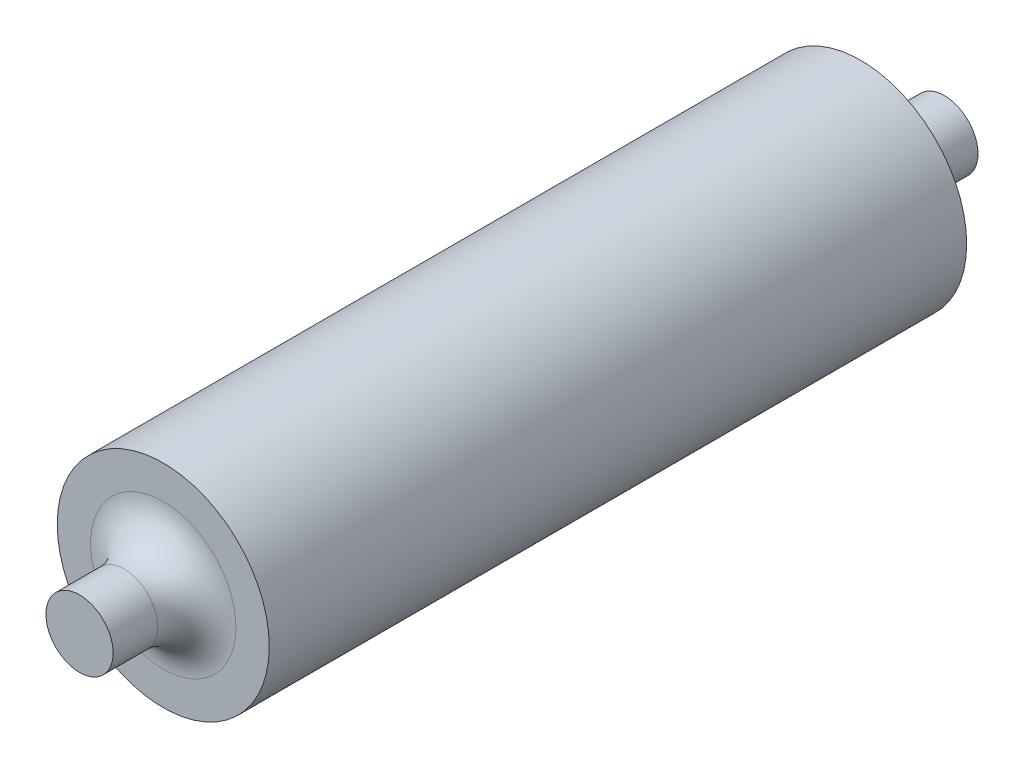
ISO-10303-21;
HEADER;
FILE_DESCRIPTION(('STEP AP214'),'2;1');
FILE_NAME('part.step','',(''),(''),'','','');
FILE_SCHEMA(('AUTOMOTIVE_DESIGN { 1 0 10303 214 1 1 1 1 }'));
ENDSEC;
DATA;
#1=APPLICATION_CONTEXT('core data for automotive mechanical design processes');
#2=APPLICATION_PROTOCOL_DEFINITION('international standard','automotive_design',2000,#1);
#3=PRODUCT_CONTEXT('',#1,'mechanical');
#4=PRODUCT('Part','Part','',(#3));
#5=PRODUCT_RELATED_PRODUCT_CATEGORY('part','',(#4));
#6=PRODUCT_DEFINITION_FORMATION('','',#4);
#7=PRODUCT_DEFINITION_CONTEXT('part definition',#1,'design');
#8=PRODUCT_DEFINITION('design','',#6,#7);
#9=PRODUCT_DEFINITION_SHAPE('','',#8);
#10=(LENGTH_UNIT() NAMED_UNIT(*) SI_UNIT(.MILLI.,.METRE.));
#11=(NAMED_UNIT(*) PLANE_ANGLE_UNIT() SI_UNIT($,.RADIAN.));
#12=(NAMED_UNIT(*) SI_UNIT($,.STERADIAN.) SOLID_ANGLE_UNIT());
#13=UNCERTAINTY_MEASURE_WITH_UNIT(LENGTH_MEASURE(1.E-05),#10,'distance_accuracy_value','');
#14=(GEOMETRIC_REPRESENTATION_CONTEXT(3) GLOBAL_UNCERTAINTY_ASSIGNED_CONTEXT((#13)) GLOBAL_UNIT_ASSIGNED_CONTEXT((#10,
#11,#12)) REPRESENTATION_CONTEXT('',''));
#15=CARTESIAN_POINT('',(0.,0.,0.));
#16=DIRECTION('',(0.,0.,1.));
#17=DIRECTION('',(1.,0.,0.));
#18=AXIS2_PLACEMENT_3D('',#15,#16,#17);
#19=CARTESIAN_POINT('',(0.,0.,-125.));
#20=DIRECTION('',(0.,0.,1.));
#21=DIRECTION('',(1.,0.,0.));
#22=AXIS2_PLACEMENT_3D('',#19,#20,#21);
#23=CYLINDRICAL_SURFACE('',#22,19.);
#24=CARTESIAN_POINT('',(0.,0.,-125.));
#25=DIRECTION('',(0.,0.,1.));
#26=DIRECTION('',(1.,0.,0.));
#27=AXIS2_PLACEMENT_3D('',#24,#25,#26);
#28=CIRCLE('',#27,19.);
#29=CARTESIAN_POINT('',(19.,0.,-125.));
#30=VERTEX_POINT('',#29);
#31=EDGE_CURVE('E108',#30,#30,#28,.T.);
#32=ORIENTED_EDGE('',*,*,#31,.T.);
#33=EDGE_LOOP('',(#32));
#34=FACE_BOUND('',#33,.T.);
#35=CARTESIAN_POINT('',(0.,0.,0.));
#36=DIRECTION('',(0.,0.,1.));
#37=DIRECTION('',(1.,0.,0.));
#38=AXIS2_PLACEMENT_3D('',#35,#36,#37);
#39=CIRCLE('',#38,19.);
#40=CARTESIAN_POINT('',(19.,0.,0.));
#41=VERTEX_POINT('',#40);
#42=EDGE_CURVE('E109',#41,#41,#39,.T.);
#43=ORIENTED_EDGE('',*,*,#42,.F.);
#44=EDGE_LOOP('',(#43));
#45=FACE_BOUND('',#44,.T.);
#46=ADVANCED_FACE('F38',(#34,#45),#23,.T.);
#47=CARTESIAN_POINT('',(0.,0.,-125.));
#48=DIRECTION('',(0.,0.,1.));
#49=DIRECTION('',(1.,0.,0.));
#50=AXIS2_PLACEMENT_3D('',#47,#48,#49);
#51=PLANE('',#50);
#52=CARTESIAN_POINT('',(0.,0.,-125.));
#53=DIRECTION('',(0.,0.,1.));
#54=DIRECTION('',(1.,0.,0.));
#55=AXIS2_PLACEMENT_3D('',#52,#53,#54);
#56=CIRCLE('',#55,13.025);
#57=CARTESIAN_POINT('',(13.025,0.,-125.));
#58=VERTEX_POINT('',#57);
#59=EDGE_CURVE('E47',#58,#58,#56,.T.);
#60=ORIENTED_EDGE('',*,*,#59,.T.);
#61=EDGE_LOOP('',(#60));
#62=FACE_BOUND('',#61,.T.);
#63=ORIENTED_EDGE('',*,*,#31,.F.);
#64=EDGE_LOOP('',(#63));
#65=FACE_BOUND('',#64,.T.);
#66=ADVANCED_FACE('F219',(#62,#65),#51,.F.);
#67=CARTESIAN_POINT('',(0.,0.,0.));
#68=DIRECTION('',(0.,0.,1.));
#69=DIRECTION('',(1.,0.,0.));
#70=AXIS2_PLACEMENT_3D('',#67,#68,#69);
#71=PLANE('',#70);
#72=CARTESIAN_POINT('',(0.,0.,0.));
#73=DIRECTION('',(0.,0.,1.));
#74=DIRECTION('',(1.,0.,0.));
#75=AXIS2_PLACEMENT_3D('',#72,#73,#74);
#76=CIRCLE('',#75,13.025);
#77=CARTESIAN_POINT('',(13.025,0.,0.));
#78=VERTEX_POINT('',#77);
#79=EDGE_CURVE('E52',#78,#78,#76,.F.);
#80=ORIENTED_EDGE('',*,*,#79,.T.);
#81=EDGE_LOOP('',(#80));
#82=FACE_BOUND('',#81,.T.);
#83=ORIENTED_EDGE('',*,*,#42,.T.);
#84=EDGE_LOOP('',(#83));
#85=FACE_BOUND('',#84,.T.);
#86=ADVANCED_FACE('F201',(#82,#85),#71,.T.);
#87=CARTESIAN_POINT('',(0.,0.,15.));
#88=DIRECTION('',(0.,0.,1.));
#89=DIRECTION('',(1.,0.,0.));
#90=AXIS2_PLACEMENT_3D('',#87,#88,#89);
#91=PLANE('',#90);
#92=CARTESIAN_POINT('',(0.,0.,15.));
#93=DIRECTION('',(0.,0.,1.));
#94=DIRECTION('',(1.,0.,0.));
#95=AXIS2_PLACEMENT_3D('',#92,#93,#94);
#96=CIRCLE('',#95,6.025);
#97=CARTESIAN_POINT('',(6.025,0.,15.));
#98=VERTEX_POINT('',#97);
#99=EDGE_CURVE('E89',#98,#98,#96,.T.);
#100=ORIENTED_EDGE('',*,*,#99,.T.);
#101=EDGE_LOOP('',(#100));
#102=FACE_BOUND('',#101,.T.);
#103=ADVANCED_FACE('F197',(#102),#91,.T.);
#104=CARTESIAN_POINT('',(0.,0.,-140.));
#105=DIRECTION('',(0.,0.,1.));
#106=DIRECTION('',(1.,0.,0.));
#107=AXIS2_PLACEMENT_3D('',#104,#105,#106);
#108=CYLINDRICAL_SURFACE('',#107,6.025);
#109=CARTESIAN_POINT('',(0.,0.,7.00000000000001));
#110=DIRECTION('',(0.,0.,1.));
#111=DIRECTION('',(1.,0.,0.));
#112=AXIS2_PLACEMENT_3D('',#109,#110,#111);
#113=CIRCLE('',#112,6.025);
#114=CARTESIAN_POINT('',(6.025,0.,7.00000000000001));
#115=VERTEX_POINT('',#114);
#116=EDGE_CURVE('E57',#115,#115,#113,.T.);
#117=ORIENTED_EDGE('',*,*,#116,.T.);
#118=EDGE_LOOP('',(#117));
#119=FACE_BOUND('',#118,.T.);
#120=ORIENTED_EDGE('',*,*,#99,.F.);
#121=EDGE_LOOP('',(#120));
#122=FACE_BOUND('',#121,.T.);
#123=ADVANCED_FACE('F200',(#119,#122),#108,.T.);
#124=CARTESIAN_POINT('',(0.,0.,-132.));
#125=DIRECTION('',(0.,0.,1.));
#126=DIRECTION('',(1.,0.,0.));
#127=AXIS2_PLACEMENT_3D('',#124,#125,#126);
#128=CIRCLE('',#127,6.025);
#129=CARTESIAN_POINT('',(6.025,0.,-132.));
#130=VERTEX_POINT('',#129);
#131=EDGE_CURVE('E11',#130,#130,#128,.F.);
#132=ORIENTED_EDGE('',*,*,#131,.T.);
#133=EDGE_LOOP('',(#132));
#134=FACE_BOUND('',#133,.T.);
#135=CARTESIAN_POINT('',(0.,0.,-140.));
#136=DIRECTION('',(0.,0.,1.));
#137=DIRECTION('',(1.,0.,0.));
#138=AXIS2_PLACEMENT_3D('',#135,#136,#137);
#139=CIRCLE('',#138,6.025);
#140=CARTESIAN_POINT('',(6.025,0.,-140.));
#141=VERTEX_POINT('',#140);
#142=EDGE_CURVE('E100',#141,#141,#139,.T.);
#143=ORIENTED_EDGE('',*,*,#142,.T.);
#144=EDGE_LOOP('',(#143));
#145=FACE_BOUND('',#144,.T.);
#146=ADVANCED_FACE('F207',(#134,#145),#108,.T.);
#147=CARTESIAN_POINT('',(0.,0.,-140.));
#148=DIRECTION('',(0.,0.,1.));
#149=DIRECTION('',(1.,0.,0.));
#150=AXIS2_PLACEMENT_3D('',#147,#148,#149);
#151=PLANE('',#150);
#152=ORIENTED_EDGE('',*,*,#142,.F.);
#153=EDGE_LOOP('',(#152));
#154=FACE_BOUND('',#153,.T.);
#155=ADVANCED_FACE('F203',(#154),#151,.F.);
#156=CARTESIAN_POINT('',(0.,0.,7.00000000000001));
#157=DIRECTION('',(0.,0.,1.));
#158=DIRECTION('',(1.,0.,0.));
#159=AXIS2_PLACEMENT_3D('',#156,#157,#158);
#160=TOROIDAL_SURFACE('',#159,13.025,7.);
#161=ORIENTED_EDGE('',*,*,#79,.F.);
#162=EDGE_LOOP('',(#161));
#163=FACE_BOUND('',#162,.T.);
#164=ORIENTED_EDGE('',*,*,#116,.F.);
#165=EDGE_LOOP('',(#164));
#166=FACE_BOUND('',#165,.T.);
#167=ADVANCED_FACE('F206',(#163,#166),#160,.F.);
#168=CARTESIAN_POINT('',(0.,0.,-132.));
#169=DIRECTION('',(0.,0.,1.));
#170=DIRECTION('',(1.,0.,0.));
#171=AXIS2_PLACEMENT_3D('',#168,#169,#170);
#172=TOROIDAL_SURFACE('',#171,13.025,7.);
#173=ORIENTED_EDGE('',*,*,#131,.F.);
#174=EDGE_LOOP('',(#173));
#175=FACE_BOUND('',#174,.T.);
#176=ORIENTED_EDGE('',*,*,#59,.F.);
#177=EDGE_LOOP('',(#176));
#178=FACE_BOUND('',#177,.T.);
#179=ADVANCED_FACE('F40',(#175,#178),#172,.F.);
#180=CLOSED_SHELL('',(#46,#66,#86,#103,#123,#146,#155,#167,#179));
#181=CARTESIAN_POINT('',(0.,0.,-27.5));
#182=DIRECTION('',(0.,0.,1.));
#183=DIRECTION('',(1.,0.,0.));
#184=AXIS2_PLACEMENT_3D('',#181,#182,#183);
#185=PLANE('',#184);
#186=CARTESIAN_POINT('',(0.,0.,-27.5));
#187=DIRECTION('',(0.,0.,1.));
#188=DIRECTION('',(1.,0.,0.));
#189=AXIS2_PLACEMENT_3D('',#186,#187,#188);
#190=CIRCLE('',#189,6.025);
#191=CARTESIAN_POINT('',(6.025,0.,-27.5));
#192=VERTEX_POINT('',#191);
#193=EDGE_CURVE('E70',#192,#192,#190,.F.);
#194=ORIENTED_EDGE('',*,*,#193,.T.);
#195=EDGE_LOOP('',(#194));
#196=FACE_BOUND('',#195,.T.);
#197=CARTESIAN_POINT('',(0.,0.,-27.5));
#198=DIRECTION('',(0.,0.,1.));
#199=DIRECTION('',(1.,0.,0.));
#200=AXIS2_PLACEMENT_3D('',#197,#198,#199);
#201=CIRCLE('',#200,14.);
#202=CARTESIAN_POINT('',(14.,0.,-27.5));
#203=VERTEX_POINT('',#202);
#204=EDGE_CURVE('E69',#203,#203,#201,.F.);
#205=ORIENTED_EDGE('',*,*,#204,.F.);
#206=EDGE_LOOP('',(#205));
#207=FACE_BOUND('',#206,.T.);
#208=ADVANCED_FACE('F147',(#196,#207),#185,.T.);
#209=CARTESIAN_POINT('',(0.,0.,-125.));
#210=DIRECTION('',(0.,0.,1.));
#211=DIRECTION('',(1.,0.,0.));
#212=AXIS2_PLACEMENT_3D('',#209,#210,#211);
#213=CYLINDRICAL_SURFACE('',#212,14.);
#214=ORIENTED_EDGE('',*,*,#204,.T.);
#215=EDGE_LOOP('',(#214));
#216=FACE_BOUND('',#215,.T.);
#217=CARTESIAN_POINT('',(0.,0.,-7.50000000000001));
#218=DIRECTION('',(0.,0.,1.));
#219=DIRECTION('',(1.,0.,0.));
#220=AXIS2_PLACEMENT_3D('',#217,#218,#219);
#221=CIRCLE('',#220,14.);
#222=CARTESIAN_POINT('',(14.,0.,-7.50000000000001));
#223=VERTEX_POINT('',#222);
#224=EDGE_CURVE('E104',#223,#223,#221,.F.);
#225=ORIENTED_EDGE('',*,*,#224,.F.);
#226=EDGE_LOOP('',(#225));
#227=FACE_BOUND('',#226,.T.);
#228=ADVANCED_FACE('F144',(#216,#227),#213,.F.);
#229=CARTESIAN_POINT('',(0.,0.,-7.5));
#230=DIRECTION('',(0.,0.,1.));
#231=DIRECTION('',(1.,0.,0.));
#232=AXIS2_PLACEMENT_3D('',#229,#230,#231);
#233=PLANE('',#232);
#234=CARTESIAN_POINT('',(0.,0.,-7.50000000000001));
#235=DIRECTION('',(0.,0.,1.));
#236=DIRECTION('',(1.,0.,0.));
#237=AXIS2_PLACEMENT_3D('',#234,#235,#236);
#238=CIRCLE('',#237,6.025);
#239=CARTESIAN_POINT('',(6.025,0.,-7.50000000000001));
#240=VERTEX_POINT('',#239);
#241=EDGE_CURVE('E99',#240,#240,#238,.T.);
#242=ORIENTED_EDGE('',*,*,#241,.T.);
#243=EDGE_LOOP('',(#242));
#244=FACE_BOUND('',#243,.T.);
#245=ORIENTED_EDGE('',*,*,#224,.T.);
#246=EDGE_LOOP('',(#245));
#247=FACE_BOUND('',#246,.T.);
#248=ADVANCED_FACE('F157',(#244,#247),#233,.F.);
#249=ORIENTED_EDGE('',*,*,#193,.F.);
#250=EDGE_LOOP('',(#249));
#251=FACE_BOUND('',#250,.T.);
#252=ORIENTED_EDGE('',*,*,#241,.F.);
#253=EDGE_LOOP('',(#252));
#254=FACE_BOUND('',#253,.T.);
#255=ADVANCED_FACE('F216',(#251,#254),#108,.T.);
#256=CLOSED_SHELL('',(#208,#228,#248,#255));
#257=CARTESIAN_POINT('',(0.,0.,-87.5));
#258=DIRECTION('',(0.,0.,1.));
#259=DIRECTION('',(1.,0.,0.));
#260=AXIS2_PLACEMENT_3D('',#257,#258,#259);
#261=PLANE('',#260);
#262=CARTESIAN_POINT('',(0.,0.,-87.5));
#263=DIRECTION('',(0.,0.,1.));
#264=DIRECTION('',(1.,0.,0.));
#265=AXIS2_PLACEMENT_3D('',#262,#263,#264);
#266=CIRCLE('',#265,6.025);
#267=CARTESIAN_POINT('',(6.025,0.,-87.5));
#268=VERTEX_POINT('',#267);
#269=EDGE_CURVE('E80',#268,#268,#266,.F.);
#270=ORIENTED_EDGE('',*,*,#269,.T.);
#271=EDGE_LOOP('',(#270));
#272=FACE_BOUND('',#271,.T.);
#273=CARTESIAN_POINT('',(0.,0.,-87.5));
#274=DIRECTION('',(0.,0.,1.));
#275=DIRECTION('',(1.,0.,0.));
#276=AXIS2_PLACEMENT_3D('',#273,#274,#275);
#277=CIRCLE('',#276,14.);
#278=CARTESIAN_POINT('',(14.,0.,-87.5));
#279=VERTEX_POINT('',#278);
#280=EDGE_CURVE('E68',#279,#279,#277,.F.);
#281=ORIENTED_EDGE('',*,*,#280,.F.);
#282=EDGE_LOOP('',(#281));
#283=FACE_BOUND('',#282,.T.);
#284=ADVANCED_FACE('F168',(#272,#283),#261,.T.);
#285=ORIENTED_EDGE('',*,*,#280,.T.);
#286=EDGE_LOOP('',(#285));
#287=FACE_BOUND('',#286,.T.);
#288=CARTESIAN_POINT('',(0.,0.,-67.5));
#289=DIRECTION('',(0.,0.,1.));
#290=DIRECTION('',(1.,0.,0.));
#291=AXIS2_PLACEMENT_3D('',#288,#289,#290);
#292=CIRCLE('',#291,14.);
#293=CARTESIAN_POINT('',(14.,0.,-67.5));
#294=VERTEX_POINT('',#293);
#295=EDGE_CURVE('E84',#294,#294,#292,.F.);
#296=ORIENTED_EDGE('',*,*,#295,.F.);
#297=EDGE_LOOP('',(#296));
#298=FACE_BOUND('',#297,.T.);
#299=ADVANCED_FACE('F160',(#287,#298),#213,.F.);
#300=CARTESIAN_POINT('',(0.,0.,-67.5));
#301=DIRECTION('',(0.,0.,1.));
#302=DIRECTION('',(1.,0.,0.));
#303=AXIS2_PLACEMENT_3D('',#300,#301,#302);
#304=PLANE('',#303);
#305=CARTESIAN_POINT('',(0.,0.,-67.5));
#306=DIRECTION('',(0.,0.,1.));
#307=DIRECTION('',(1.,0.,0.));
#308=AXIS2_PLACEMENT_3D('',#305,#306,#307);
#309=CIRCLE('',#308,6.025);
#310=CARTESIAN_POINT('',(6.025,0.,-67.5));
#311=VERTEX_POINT('',#310);
#312=EDGE_CURVE('E85',#311,#311,#309,.F.);
#313=ORIENTED_EDGE('',*,*,#312,.F.);
#314=EDGE_LOOP('',(#313));
#315=FACE_BOUND('',#314,.T.);
#316=ORIENTED_EDGE('',*,*,#295,.T.);
#317=EDGE_LOOP('',(#316));
#318=FACE_BOUND('',#317,.T.);
#319=ADVANCED_FACE('F175',(#315,#318),#304,.F.);
#320=ORIENTED_EDGE('',*,*,#269,.F.);
#321=EDGE_LOOP('',(#320));
#322=FACE_BOUND('',#321,.T.);
#323=ORIENTED_EDGE('',*,*,#312,.T.);
#324=EDGE_LOOP('',(#323));
#325=FACE_BOUND('',#324,.T.);
#326=ADVANCED_FACE('F195',(#322,#325),#108,.T.);
#327=CLOSED_SHELL('',(#284,#299,#319,#326));
#328=CARTESIAN_POINT('',(0.,0.,-57.5));
#329=DIRECTION('',(0.,0.,1.));
#330=DIRECTION('',(1.,0.,0.));
#331=AXIS2_PLACEMENT_3D('',#328,#329,#330);
#332=CIRCLE('',#331,14.);
#333=CARTESIAN_POINT('',(14.,0.,-57.5));
#334=VERTEX_POINT('',#333);
#335=EDGE_CURVE('E79',#334,#334,#332,.F.);
#336=ORIENTED_EDGE('',*,*,#335,.T.);
#337=EDGE_LOOP('',(#336));
#338=FACE_BOUND('',#337,.T.);
#339=CARTESIAN_POINT('',(0.,0.,-37.5));
#340=DIRECTION('',(0.,0.,1.));
#341=DIRECTION('',(1.,0.,0.));
#342=AXIS2_PLACEMENT_3D('',#339,#340,#341);
#343=CIRCLE('',#342,14.);
#344=CARTESIAN_POINT('',(14.,0.,-37.5));
#345=VERTEX_POINT('',#344);
#346=EDGE_CURVE('E63',#345,#345,#343,.F.);
#347=ORIENTED_EDGE('',*,*,#346,.F.);
#348=EDGE_LOOP('',(#347));
#349=FACE_BOUND('',#348,.T.);
#350=ADVANCED_FACE('F159',(#338,#349),#213,.F.);
#351=CARTESIAN_POINT('',(0.,0.,-57.5));
#352=DIRECTION('',(0.,0.,1.));
#353=DIRECTION('',(1.,0.,0.));
#354=AXIS2_PLACEMENT_3D('',#351,#352,#353);
#355=CIRCLE('',#354,6.025);
#356=CARTESIAN_POINT('',(6.025,0.,-57.5));
#357=VERTEX_POINT('',#356);
#358=EDGE_CURVE('E90',#357,#357,#355,.F.);
#359=ORIENTED_EDGE('',*,*,#358,.F.);
#360=EDGE_LOOP('',(#359));
#361=FACE_BOUND('',#360,.T.);
#362=CARTESIAN_POINT('',(0.,0.,-37.5));
#363=DIRECTION('',(0.,0.,1.));
#364=DIRECTION('',(1.,0.,0.));
#365=AXIS2_PLACEMENT_3D('',#362,#363,#364);
#366=CIRCLE('',#365,6.025);
#367=CARTESIAN_POINT('',(6.025,0.,-37.5));
#368=VERTEX_POINT('',#367);
#369=EDGE_CURVE('E64',#368,#368,#366,.F.);
#370=ORIENTED_EDGE('',*,*,#369,.T.);
#371=EDGE_LOOP('',(#370));
#372=FACE_BOUND('',#371,.T.);
#373=ADVANCED_FACE('F192',(#361,#372),#108,.T.);
#374=CARTESIAN_POINT('',(0.,0.,-57.5));
#375=DIRECTION('',(0.,0.,1.));
#376=DIRECTION('',(1.,0.,0.));
#377=AXIS2_PLACEMENT_3D('',#374,#375,#376);
#378=PLANE('',#377);
#379=ORIENTED_EDGE('',*,*,#358,.T.);
#380=EDGE_LOOP('',(#379));
#381=FACE_BOUND('',#380,.T.);
#382=ORIENTED_EDGE('',*,*,#335,.F.);
#383=EDGE_LOOP('',(#382));
#384=FACE_BOUND('',#383,.T.);
#385=ADVANCED_FACE('F189',(#381,#384),#378,.T.);
#386=CARTESIAN_POINT('',(0.,0.,-37.5));
#387=DIRECTION('',(0.,0.,1.));
#388=DIRECTION('',(1.,0.,0.));
#389=AXIS2_PLACEMENT_3D('',#386,#387,#388);
#390=PLANE('',#389);
#391=ORIENTED_EDGE('',*,*,#369,.F.);
#392=EDGE_LOOP('',(#391));
#393=FACE_BOUND('',#392,.T.);
#394=ORIENTED_EDGE('',*,*,#346,.T.);
#395=EDGE_LOOP('',(#394));
#396=FACE_BOUND('',#395,.T.);
#397=ADVANCED_FACE('F181',(#393,#396),#390,.F.);
#398=CLOSED_SHELL('',(#350,#373,#385,#397));
#399=CARTESIAN_POINT('',(0.,0.,-117.5));
#400=DIRECTION('',(0.,0.,-1.));
#401=DIRECTION('',(-1.,0.,0.));
#402=AXIS2_PLACEMENT_3D('',#399,#400,#401);
#403=CIRCLE('',#402,14.);
#404=CARTESIAN_POINT('',(-14.,0.,-117.5));
#405=VERTEX_POINT('',#404);
#406=EDGE_CURVE('E94',#405,#405,#403,.F.);
#407=ORIENTED_EDGE('',*,*,#406,.F.);
#408=EDGE_LOOP('',(#407));
#409=FACE_BOUND('',#408,.T.);
#410=CARTESIAN_POINT('',(0.,0.,-97.5));
#411=DIRECTION('',(0.,0.,1.));
#412=DIRECTION('',(1.,0.,0.));
#413=AXIS2_PLACEMENT_3D('',#410,#411,#412);
#414=CIRCLE('',#413,14.);
#415=CARTESIAN_POINT('',(14.,0.,-97.5));
#416=VERTEX_POINT('',#415);
#417=EDGE_CURVE('E74',#416,#416,#414,.F.);
#418=ORIENTED_EDGE('',*,*,#417,.F.);
#419=EDGE_LOOP('',(#418));
#420=FACE_BOUND('',#419,.T.);
#421=ADVANCED_FACE('F177',(#409,#420),#213,.F.);
#422=CARTESIAN_POINT('',(0.,0.,-117.5));
#423=DIRECTION('',(0.,0.,-1.));
#424=DIRECTION('',(-1.,0.,0.));
#425=AXIS2_PLACEMENT_3D('',#422,#423,#424);
#426=CIRCLE('',#425,6.025);
#427=CARTESIAN_POINT('',(-6.025,0.,-117.5));
#428=VERTEX_POINT('',#427);
#429=EDGE_CURVE('E95',#428,#428,#426,.T.);
#430=ORIENTED_EDGE('',*,*,#429,.F.);
#431=EDGE_LOOP('',(#430));
#432=FACE_BOUND('',#431,.T.);
#433=CARTESIAN_POINT('',(0.,0.,-97.5));
#434=DIRECTION('',(0.,0.,1.));
#435=DIRECTION('',(1.,0.,0.));
#436=AXIS2_PLACEMENT_3D('',#433,#434,#435);
#437=CIRCLE('',#436,6.025);
#438=CARTESIAN_POINT('',(6.025,0.,-97.5));
#439=VERTEX_POINT('',#438);
#440=EDGE_CURVE('E75',#439,#439,#437,.F.);
#441=ORIENTED_EDGE('',*,*,#440,.T.);
#442=EDGE_LOOP('',(#441));
#443=FACE_BOUND('',#442,.T.);
#444=ADVANCED_FACE('F213',(#432,#443),#108,.T.);
#445=CARTESIAN_POINT('',(0.,0.,-117.5));
#446=DIRECTION('',(0.,0.,-1.));
#447=DIRECTION('',(-1.,0.,0.));
#448=AXIS2_PLACEMENT_3D('',#445,#446,#447);
#449=PLANE('',#448);
#450=ORIENTED_EDGE('',*,*,#429,.T.);
#451=EDGE_LOOP('',(#450));
#452=FACE_BOUND('',#451,.T.);
#453=ORIENTED_EDGE('',*,*,#406,.T.);
#454=EDGE_LOOP('',(#453));
#455=FACE_BOUND('',#454,.T.);
#456=ADVANCED_FACE('F185',(#452,#455),#449,.F.);
#457=CARTESIAN_POINT('',(0.,0.,-97.5));
#458=DIRECTION('',(0.,0.,1.));
#459=DIRECTION('',(1.,0.,0.));
#460=AXIS2_PLACEMENT_3D('',#457,#458,#459);
#461=PLANE('',#460);
#462=ORIENTED_EDGE('',*,*,#440,.F.);
#463=EDGE_LOOP('',(#462));
#464=FACE_BOUND('',#463,.T.);
#465=ORIENTED_EDGE('',*,*,#417,.T.);
#466=EDGE_LOOP('',(#465));
#467=FACE_BOUND('',#466,.T.);
#468=ADVANCED_FACE('F182',(#464,#467),#461,.F.);
#469=CLOSED_SHELL('',(#421,#444,#456,#468));
#470=ORIENTED_CLOSED_SHELL('',*,#256,.T.);
#471=ORIENTED_CLOSED_SHELL('',*,#327,.T.);
#472=ORIENTED_CLOSED_SHELL('',*,#398,.T.);
#473=ORIENTED_CLOSED_SHELL('',*,#469,.T.);
#474=BREP_WITH_VOIDS('B2',#180,(#470,#471,#472,#473));
#475=ADVANCED_BREP_SHAPE_REPRESENTATION('',(#18,#474),#14);
#476=SHAPE_DEFINITION_REPRESENTATION(#9,#475);
ENDSEC;
END-ISO-10303-21;
